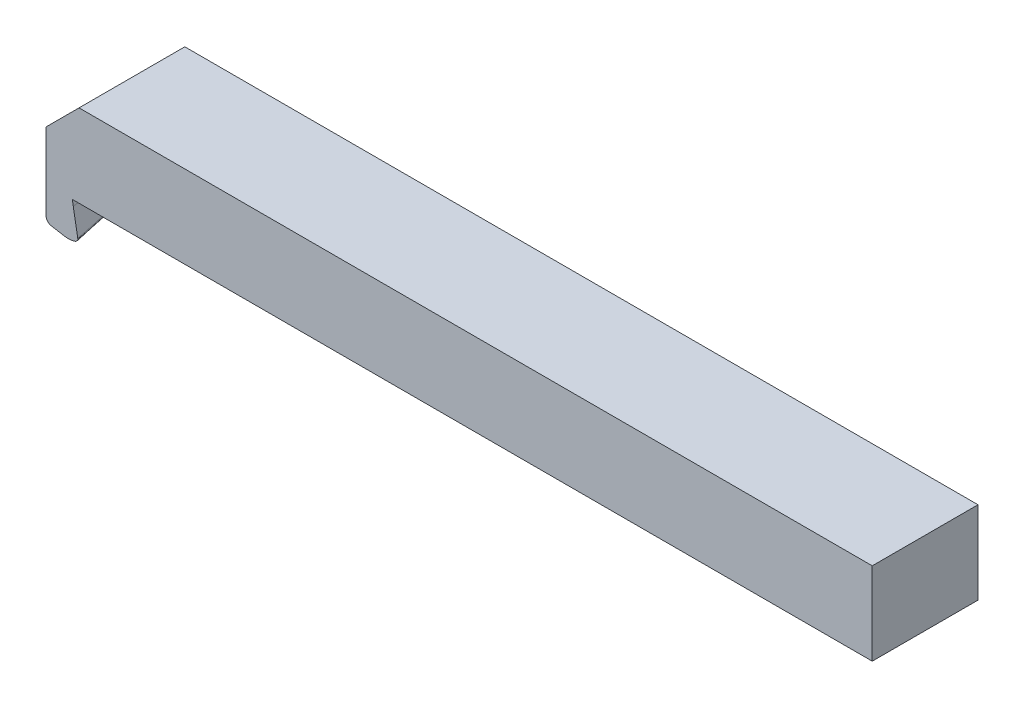
ISO-10303-21;
HEADER;
FILE_DESCRIPTION(('STEP AP214'),'2;1');
FILE_NAME('part.step','',(''),(''),'','','');
FILE_SCHEMA(('AUTOMOTIVE_DESIGN { 1 0 10303 214 1 1 1 1 }'));
ENDSEC;
DATA;
#1=APPLICATION_CONTEXT('core data for automotive mechanical design processes');
#2=APPLICATION_PROTOCOL_DEFINITION('international standard','automotive_design',2000,#1);
#3=PRODUCT_CONTEXT('',#1,'mechanical');
#4=PRODUCT('Part','Part','',(#3));
#5=PRODUCT_RELATED_PRODUCT_CATEGORY('part','',(#4));
#6=PRODUCT_DEFINITION_FORMATION('','',#4);
#7=PRODUCT_DEFINITION_CONTEXT('part definition',#1,'design');
#8=PRODUCT_DEFINITION('design','',#6,#7);
#9=PRODUCT_DEFINITION_SHAPE('','',#8);
#10=(LENGTH_UNIT() NAMED_UNIT(*) SI_UNIT(.MILLI.,.METRE.));
#11=(NAMED_UNIT(*) PLANE_ANGLE_UNIT() SI_UNIT($,.RADIAN.));
#12=(NAMED_UNIT(*) SI_UNIT($,.STERADIAN.) SOLID_ANGLE_UNIT());
#13=UNCERTAINTY_MEASURE_WITH_UNIT(LENGTH_MEASURE(1.E-05),#10,'distance_accuracy_value','');
#14=(GEOMETRIC_REPRESENTATION_CONTEXT(3) GLOBAL_UNCERTAINTY_ASSIGNED_CONTEXT((#13)) GLOBAL_UNIT_ASSIGNED_CONTEXT((#10,
#11,#12)) REPRESENTATION_CONTEXT('',''));
#15=CARTESIAN_POINT('',(0.,0.,0.));
#16=DIRECTION('',(0.,0.,1.));
#17=DIRECTION('',(1.,0.,0.));
#18=AXIS2_PLACEMENT_3D('',#15,#16,#17);
#19=CARTESIAN_POINT('',(-5.95745597294686,-8.78626996850213,0.));
#20=DIRECTION('',(-0.172807384598718,-0.980039378570434,-0.0982874573861199));
#21=DIRECTION('',(0.984807753012209,-0.173648177666924,0.));
#22=AXIS2_PLACEMENT_3D('',#19,#20,#21);
#23=PLANE('',#22);
#24=DIRECTION('',(0.,-0.0997887149885709,0.995008649390009));
#25=VECTOR('',#24,1.);
#26=CARTESIAN_POINT('',(1.65270364466615,-6.60104733206253,-35.1692485132997));
#27=LINE('',#26,#25);
#28=CARTESIAN_POINT('',(1.65270364466615,-7.23813574442296,-28.816741811541));
#29=VERTEX_POINT('',#28);
#30=CARTESIAN_POINT('',(1.65270364466615,-10.1281464365853,0.));
#31=VERTEX_POINT('',#30);
#32=EDGE_CURVE('E64',#29,#31,#27,.T.);
#33=ORIENTED_EDGE('',*,*,#32,.F.);
#34=DIRECTION('',(0.120990158545817,-0.12015437805514,0.985354914215807));
#35=VECTOR('',#34,1.);
#36=CARTESIAN_POINT('',(0.697622706499073,-6.28965235125239,-36.5950083020371));
#37=LINE('',#36,#35);
#38=CARTESIAN_POINT('',(5.19106541690834,-10.752055084539,0.));
#39=VERTEX_POINT('',#38);
#40=EDGE_CURVE('E71',#29,#39,#37,.T.);
#41=ORIENTED_EDGE('',*,*,#40,.T.);
#42=DIRECTION('',(-0.984807753012209,0.173648177666924,0.));
#43=VECTOR('',#42,1.);
#44=CARTESIAN_POINT('',(-1.68217993521837,-9.54011648393002,0.));
#45=LINE('',#44,#43);
#46=EDGE_CURVE('E148',#39,#31,#45,.T.);
#47=ORIENTED_EDGE('',*,*,#46,.T.);
#48=EDGE_LOOP('',(#33,#41,#47));
#49=FACE_BOUND('',#48,.T.);
#50=ADVANCED_FACE('F51',(#49),#23,.T.);
#51=CARTESIAN_POINT('',(4.31739641750005,2.24596703289002,-31.9999996430777));
#52=DIRECTION('',(-0.979944728638938,-0.172790716653391,0.099255715458433));
#53=DIRECTION('',(0.173648198516169,-0.984807749335925,0.));
#54=AXIS2_PLACEMENT_3D('',#51,#52,#53);
#55=PLANE('',#54);
#56=DIRECTION('',(0.120990158545817,-0.12015437805514,0.985354914215807));
#57=VECTOR('',#56,1.);
#58=CARTESIAN_POINT('',(5.12753518504776,-4.98805609598557,-36.5950083020371));
#59=LINE('',#58,#57);
#60=CARTESIAN_POINT('',(5.69174876336723,-5.54837217795491,-32.0000013300127));
#61=VERTEX_POINT('',#60);
#62=CARTESIAN_POINT('',(9.62097789545703,-9.45045882927214,0.));
#63=VERTEX_POINT('',#62);
#64=EDGE_CURVE('E140',#61,#63,#59,.T.);
#65=ORIENTED_EDGE('',*,*,#64,.F.);
#66=DIRECTION('',(0.17364817766692,-0.984807753012187,-2.12243050308961E-07));
#67=VECTOR('',#66,1.);
#68=CARTESIAN_POINT('',(4.31739641750005,2.24596703289002,-31.9999996430777));
#69=LINE('',#68,#67);
#70=CARTESIAN_POINT('',(4.31739641750005,2.24596703289002,-31.9999996430777));
#71=VERTEX_POINT('',#70);
#72=EDGE_CURVE('E164',#71,#61,#69,.T.);
#73=ORIENTED_EDGE('',*,*,#72,.F.);
#74=DIRECTION('',(-0.120990158545817,0.120154378055141,-0.985354914215807));
#75=VECTOR('',#74,1.);
#76=CARTESIAN_POINT('',(4.31739641750005,2.24596703289002,-31.9999996430777));
#77=LINE('',#76,#75);
#78=CARTESIAN_POINT('',(8.24662560559889,-1.65611967404935,2.14307765758873E-06));
#79=VERTEX_POINT('',#78);
#80=EDGE_CURVE('E245',#79,#71,#77,.T.);
#81=ORIENTED_EDGE('',*,*,#80,.F.);
#82=DIRECTION('',(0.17364817766692,-0.984807753012187,-2.12243050308961E-07));
#83=VECTOR('',#82,1.);
#84=CARTESIAN_POINT('',(8.24662560559889,-1.65611967404935,2.14307765758873E-06));
#85=LINE('',#84,#83);
#86=EDGE_CURVE('E156',#79,#63,#85,.T.);
#87=ORIENTED_EDGE('',*,*,#86,.T.);
#88=EDGE_LOOP('',(#65,#73,#81,#87));
#89=FACE_BOUND('',#88,.T.);
#90=ADVANCED_FACE('F274',(#89),#55,.F.);
#91=CARTESIAN_POINT('',(0.,0.,0.));
#92=DIRECTION('',(-1.,0.,0.));
#93=DIRECTION('',(0.,0.,1.));
#94=AXIS2_PLACEMENT_3D('',#91,#92,#93);
#95=PLANE('',#94);
#96=DIRECTION('',(0.,1.,0.));
#97=VECTOR('',#96,1.);
#98=CARTESIAN_POINT('',(0.,0.,-32.));
#99=LINE('',#98,#97);
#100=CARTESIAN_POINT('',(0.,-4.94927352200275,-32.));
#101=VERTEX_POINT('',#100);
#102=CARTESIAN_POINT('',(0.,15.,-32.));
#103=VERTEX_POINT('',#102);
#104=EDGE_CURVE('E174',#101,#103,#99,.T.);
#105=ORIENTED_EDGE('',*,*,#104,.F.);
#106=DIRECTION('',(0.,-0.0997887149885709,0.995008649390009));
#107=VECTOR('',#106,1.);
#108=CARTESIAN_POINT('',(0.,-4.63143182603811,-35.1692485132997));
#109=LINE('',#108,#107);
#110=CARTESIAN_POINT('',(0.,-8.15853093056085,0.));
#111=VERTEX_POINT('',#110);
#112=EDGE_CURVE('E216',#101,#111,#109,.T.);
#113=ORIENTED_EDGE('',*,*,#112,.T.);
#114=DIRECTION('',(0.,1.,0.));
#115=VECTOR('',#114,1.);
#116=CARTESIAN_POINT('',(0.,0.,0.));
#117=LINE('',#116,#115);
#118=CARTESIAN_POINT('',(0.,15.,0.));
#119=VERTEX_POINT('',#118);
#120=EDGE_CURVE('E169',#111,#119,#117,.T.);
#121=ORIENTED_EDGE('',*,*,#120,.T.);
#122=DIRECTION('',(0.,0.,-1.));
#123=VECTOR('',#122,1.);
#124=CARTESIAN_POINT('',(0.,15.,0.));
#125=LINE('',#124,#123);
#126=EDGE_CURVE('E193',#119,#103,#125,.T.);
#127=ORIENTED_EDGE('',*,*,#126,.T.);
#128=EDGE_LOOP('',(#105,#113,#121,#127));
#129=FACE_BOUND('',#128,.T.);
#130=ADVANCED_FACE('F286',(#129),#95,.T.);
#131=CARTESIAN_POINT('',(7.95460702378189,0.,-32.00005));
#132=DIRECTION('',(-0.984807753012209,-0.173648177666924,0.));
#133=DIRECTION('',(0.173648177666924,-0.984807753012209,0.));
#134=AXIS2_PLACEMENT_3D('',#131,#132,#133);
#135=PLANE('',#134);
#136=DIRECTION('',(0.0181511771607508,-0.102940441036431,0.994521895368274));
#137=VECTOR('',#136,1.);
#138=CARTESIAN_POINT('',(8.24662560559889,-1.65611967404935,2.14307765758873E-06));
#139=LINE('',#138,#137);
#140=CARTESIAN_POINT('',(7.9546070237819,0.,-15.9999999999999));
#141=VERTEX_POINT('',#140);
#142=EDGE_CURVE('E250',#141,#79,#139,.T.);
#143=ORIENTED_EDGE('',*,*,#142,.F.);
#144=DIRECTION('',(0.,0.,1.));
#145=VECTOR('',#144,1.);
#146=CARTESIAN_POINT('',(7.95460702378189,0.,-32.00005));
#147=LINE('',#146,#145);
#148=CARTESIAN_POINT('',(7.95460702378189,0.,0.));
#149=VERTEX_POINT('',#148);
#150=EDGE_CURVE('E159',#141,#149,#147,.T.);
#151=ORIENTED_EDGE('',*,*,#150,.T.);
#152=DIRECTION('',(0.173648177666924,-0.984807753012209,0.));
#153=VECTOR('',#152,1.);
#154=CARTESIAN_POINT('',(7.95460702378189,0.,0.));
#155=LINE('',#154,#153);
#156=EDGE_CURVE('E155',#149,#79,#155,.T.);
#157=ORIENTED_EDGE('',*,*,#156,.T.);
#158=EDGE_LOOP('',(#143,#151,#157));
#159=FACE_BOUND('',#158,.T.);
#160=ADVANCED_FACE('F270',(#159),#135,.F.);
#161=CARTESIAN_POINT('',(250.,0.,-32.));
#162=DIRECTION('',(0.,0.,1.));
#163=DIRECTION('',(0.,-1.,0.));
#164=AXIS2_PLACEMENT_3D('',#161,#162,#163);
#165=PLANE('',#164);
#166=ORIENTED_EDGE('',*,*,#72,.T.);
#167=CARTESIAN_POINT('',(5.69174892667737,-5.54837234013692,-32.));
#168=CARTESIAN_POINT('',(5.69559472201444,-5.57015293719416,-32.));
#169=CARTESIAN_POINT('',(5.69861002660108,-5.59208733819349,-32.));
#170=CARTESIAN_POINT('',(5.70287976276934,-5.63613886613255,-32.));
#171=CARTESIAN_POINT('',(5.70413314621049,-5.65825609397151,-32.));
#172=CARTESIAN_POINT('',(5.70477333565546,-5.70245326938706,-32.));
#173=CARTESIAN_POINT('',(5.70416593957293,-5.72453311871634,-32.));
#174=CARTESIAN_POINT('',(5.70105025073482,-5.76854749261631,-32.));
#175=CARTESIAN_POINT('',(5.69854242927031,-5.79048205185761,-32.));
#176=CARTESIAN_POINT('',(5.68811127617272,-5.85597878510246,-32.));
#177=CARTESIAN_POINT('',(5.67727820010267,-5.89911510416177,-32.));
#178=CARTESIAN_POINT('',(5.64843766040005,-5.98284511814917,-32.));
#179=CARTESIAN_POINT('',(5.63043142238097,-6.0234392460681,-32.));
#180=CARTESIAN_POINT('',(5.58302247155904,-6.11125356889244,-32.));
#181=CARTESIAN_POINT('',(5.5518859457596,-6.15753282402396,-32.));
#182=CARTESIAN_POINT('',(5.48257072191082,-6.24450993204478,-32.));
#183=CARTESIAN_POINT('',(5.44437257713406,-6.28519181734676,-32.));
#184=CARTESIAN_POINT('',(5.33898887715764,-6.383778664835,-32.));
#185=CARTESIAN_POINT('',(5.26803448432665,-6.43761332328303,-32.));
#186=CARTESIAN_POINT('',(5.11912408713444,-6.53432952908048,-32.));
#187=CARTESIAN_POINT('',(5.04115254704482,-6.57718592256942,-32.));
#188=CARTESIAN_POINT('',(4.88184885908664,-6.65380841283425,-32.));
#189=CARTESIAN_POINT('',(4.80055546322167,-6.68765663917548,-32.));
#190=CARTESIAN_POINT('',(4.63539152483625,-6.74845025453767,-32.));
#191=CARTESIAN_POINT('',(4.55151852291068,-6.77538881203322,-32.));
#192=CARTESIAN_POINT('',(4.3819440776994,-6.82358019758212,-32.));
#193=CARTESIAN_POINT('',(4.29623844846271,-6.84481806488145,-32.));
#194=CARTESIAN_POINT('',(4.1238040620772,-6.88238012866922,-32.));
#195=CARTESIAN_POINT('',(4.0370756549592,-6.89870595826316,-32.));
#196=CARTESIAN_POINT('',(3.85487664905755,-6.92841536401401,-32.));
#197=CARTESIAN_POINT('',(3.75933952713402,-6.94138704514333,-32.));
#198=CARTESIAN_POINT('',(3.56775846644736,-6.9628738826745,-32.));
#199=CARTESIAN_POINT('',(3.47171442103082,-6.9713880601471,-32.));
#200=CARTESIAN_POINT('',(3.1830168755023,-6.99097908373765,-32.));
#201=CARTESIAN_POINT('',(2.98994329744629,-6.99608241625166,-32.));
#202=CARTESIAN_POINT('',(2.60406042916701,-6.9928662446588,-32.));
#203=CARTESIAN_POINT('',(2.41125106792124,-6.9845516697429,-32.));
#204=CARTESIAN_POINT('',(2.02665006236218,-6.9559042794159,-32.));
#205=CARTESIAN_POINT('',(1.83485782434515,-6.93557949439614,-32.));
#206=CARTESIAN_POINT('',(1.5799482413055,-6.900918657548,-32.));
#207=CARTESIAN_POINT('',(1.51611658421911,-6.8915947455943,-32.));
#208=CARTESIAN_POINT('',(1.38876713457079,-6.87170909050232,-32.));
#209=CARTESIAN_POINT('',(1.32524898004394,-6.86114966565831,-32.));
#210=CARTESIAN_POINT('',(1.26183644812868,-6.84996859540374,-32.));
#211=B_SPLINE_CURVE_WITH_KNOTS('',3,(#167,#168,#169,#170,#171,#172,#173,#174,#175,#176,#177,
#178,#179,#180,#181,#182,#183,#184,#185,#186,#187,#188,#189,#190,#191,#192,#193,#194,#195,#196,
#197,#198,#199,#200,#201,#202,#203,#204,#205,#206,#207,#208,#209,#210),.UNSPECIFIED.,.F.,.F.,(4,
2,2,2,2,2,2,2,2,2,2,2,2,2,2,2,2,2,2,2,2,4),(0.,0.0663468393432494,0.132733130748207,
0.198912782902435,0.265076028374439,0.397754404350359,0.530410120485305,0.696807636653573,
0.863670405781838,1.12936352558054,1.39566007469845,1.6594384025841,1.92347652904579,
2.18820096214419,2.45283728478962,2.74195462892563,3.03113544061048,3.60993656418424,
4.18852510827154,4.7667272275244,4.96024585856891,5.1534070283953),.UNSPECIFIED.);
#212=CARTESIAN_POINT('',(1.5319357455685,-6.89373115985658,-32.0000008930785));
#213=VERTEX_POINT('',#212);
#214=EDGE_CURVE('E210',#61,#213,#211,.T.);
#215=ORIENTED_EDGE('',*,*,#214,.T.);
#216=CARTESIAN_POINT('',(1.65270364466615,-6.91888902802717,-32.));
#217=CARTESIAN_POINT('',(1.59810504045706,-6.90926145178013,-32.));
#218=CARTESIAN_POINT('',(1.54393231148034,-6.89736744351519,-32.));
#219=CARTESIAN_POINT('',(1.43676264945639,-6.86912701960965,-32.));
#220=CARTESIAN_POINT('',(1.383765665894,-6.85278079565789,-32.));
#221=CARTESIAN_POINT('',(1.2271053599493,-6.79721415288483,-32.));
#222=CARTESIAN_POINT('',(1.12567963052524,-6.75144927019023,-32.));
#223=CARTESIAN_POINT('',(0.931853360863136,-6.64378505186223,-32.));
#224=CARTESIAN_POINT('',(0.83945282062508,-6.58188571622883,-32.));
#225=CARTESIAN_POINT('',(0.666156590444165,-6.44364319370646,-32.));
#226=CARTESIAN_POINT('',(0.585260900501306,-6.36730000681748,-32.));
#227=CARTESIAN_POINT('',(0.437223610426427,-6.20227708425503,-32.));
#228=CARTESIAN_POINT('',(0.370082010294406,-6.11359734858155,-32.));
#229=CARTESIAN_POINT('',(0.251401521567228,-5.92635728729381,-32.));
#230=CARTESIAN_POINT('',(0.199862632972071,-5.82779696167955,-32.));
#231=CARTESIAN_POINT('',(0.113803992517514,-5.62347228928078,-32.));
#232=CARTESIAN_POINT('',(0.0792842406581132,-5.51770794249626,-32.));
#233=CARTESIAN_POINT('',(0.0359254874969161,-5.33452194314829,-32.));
#234=CARTESIAN_POINT('',(0.0224833940343868,-5.25815662372228,-32.));
#235=CARTESIAN_POINT('',(0.0045088536140932,-5.10429712795233,-32.));
#236=CARTESIAN_POINT('',(-1.34871086183653E-05,-5.02680177124689,-32.));
#237=CARTESIAN_POINT('',(0.,-4.94927352200282,-32.));
#238=B_SPLINE_CURVE_WITH_KNOTS('',3,(#216,#217,#218,#219,#220,#221,#222,#223,#224,#225,#226,
#227,#228,#229,#230,#231,#232,#233,#234,#235,#236,#237),.UNSPECIFIED.,.F.,.F.,(4,2,2,2,2,2,2,2,
2,2,4),(0.,0.166223517867541,0.332439880160971,0.664592604920614,0.996745329680258,
1.3288980544399,1.66105077919954,1.99320350395919,2.32535622871883,2.55748278536999,
2.789872194712),.UNSPECIFIED.);
#239=EDGE_CURVE('E208',#213,#101,#238,.T.);
#240=ORIENTED_EDGE('',*,*,#239,.T.);
#241=ORIENTED_EDGE('',*,*,#104,.T.);
#242=DIRECTION('',(-0.707106781186549,-0.707106781186546,0.));
#243=VECTOR('',#242,1.);
#244=CARTESIAN_POINT('',(0.,15.,-32.));
#245=LINE('',#244,#243);
#246=CARTESIAN_POINT('',(10.0000000000001,25.,-32.));
#247=VERTEX_POINT('',#246);
#248=EDGE_CURVE('E198',#103,#247,#245,.F.);
#249=ORIENTED_EDGE('',*,*,#248,.T.);
#250=DIRECTION('',(-1.,0.,0.));
#251=VECTOR('',#250,1.);
#252=CARTESIAN_POINT('',(250.,25.,-32.));
#253=LINE('',#252,#251);
#254=CARTESIAN_POINT('',(250.,25.,-32.));
#255=VERTEX_POINT('',#254);
#256=EDGE_CURVE('E264',#255,#247,#253,.T.);
#257=ORIENTED_EDGE('',*,*,#256,.F.);
#258=DIRECTION('',(0.,1.,0.));
#259=VECTOR('',#258,1.);
#260=CARTESIAN_POINT('',(250.,0.,-32.));
#261=LINE('',#260,#259);
#262=CARTESIAN_POINT('',(250.,0.,-32.));
#263=VERTEX_POINT('',#262);
#264=EDGE_CURVE('E177',#263,#255,#261,.T.);
#265=ORIENTED_EDGE('',*,*,#264,.F.);
#266=DIRECTION('',(-1.,0.,0.));
#267=VECTOR('',#266,1.);
#268=CARTESIAN_POINT('',(250.,0.,-32.));
#269=LINE('',#268,#267);
#270=CARTESIAN_POINT('',(7.95460702378191,0.,-32.));
#271=VERTEX_POINT('',#270);
#272=EDGE_CURVE('E194',#263,#271,#269,.T.);
#273=ORIENTED_EDGE('',*,*,#272,.T.);
#274=DIRECTION('',(0.17364817766692,-0.984807753012187,-2.12243050308961E-07));
#275=VECTOR('',#274,1.);
#276=CARTESIAN_POINT('',(7.66258848759279,1.65611941528069,-31.9999996430777));
#277=LINE('',#276,#275);
#278=CARTESIAN_POINT('',(7.66258848759279,1.65611941528069,-31.9999996430777));
#279=VERTEX_POINT('',#278);
#280=EDGE_CURVE('E161',#279,#271,#277,.T.);
#281=ORIENTED_EDGE('',*,*,#280,.F.);
#282=DIRECTION('',(0.984807753012209,-0.173648177666924,0.));
#283=VECTOR('',#282,1.);
#284=CARTESIAN_POINT('',(7.66258848759279,1.65611941528069,-31.9999996430777));
#285=LINE('',#284,#283);
#286=EDGE_CURVE('E248',#71,#279,#285,.T.);
#287=ORIENTED_EDGE('',*,*,#286,.F.);
#288=EDGE_LOOP('',(#166,#215,#240,#241,#249,#257,#265,#273,#281,#287));
#289=FACE_BOUND('',#288,.T.);
#290=ADVANCED_FACE('F213',(#289),#165,.F.);
#291=CARTESIAN_POINT('',(250.,0.,0.));
#292=DIRECTION('',(0.,0.,1.));
#293=DIRECTION('',(0.,-1.,0.));
#294=AXIS2_PLACEMENT_3D('',#291,#292,#293);
#295=PLANE('',#294);
#296=CARTESIAN_POINT('',(5.5,-9.,0.));
#297=DIRECTION('',(0.,0.,-1.));
#298=DIRECTION('',(0.984807753012209,-0.173648177666923,0.));
#299=AXIS2_PLACEMENT_3D('',#296,#297,#298);
#300=ELLIPSE('',#299,4.1857969069926,1.77908335833059);
#301=EDGE_CURVE('E137',#63,#39,#300,.T.);
#302=ORIENTED_EDGE('',*,*,#301,.F.);
#303=ORIENTED_EDGE('',*,*,#86,.F.);
#304=ORIENTED_EDGE('',*,*,#156,.F.);
#305=DIRECTION('',(-1.,0.,0.));
#306=VECTOR('',#305,1.);
#307=CARTESIAN_POINT('',(250.,0.,0.));
#308=LINE('',#307,#306);
#309=CARTESIAN_POINT('',(250.,0.,0.));
#310=VERTEX_POINT('',#309);
#311=EDGE_CURVE('E189',#310,#149,#308,.T.);
#312=ORIENTED_EDGE('',*,*,#311,.F.);
#313=DIRECTION('',(0.,1.,0.));
#314=VECTOR('',#313,1.);
#315=CARTESIAN_POINT('',(250.,0.,0.));
#316=LINE('',#315,#314);
#317=CARTESIAN_POINT('',(250.,25.,0.));
#318=VERTEX_POINT('',#317);
#319=EDGE_CURVE('E170',#310,#318,#316,.T.);
#320=ORIENTED_EDGE('',*,*,#319,.T.);
#321=DIRECTION('',(-1.,0.,0.));
#322=VECTOR('',#321,1.);
#323=CARTESIAN_POINT('',(250.,25.,0.));
#324=LINE('',#323,#322);
#325=CARTESIAN_POINT('',(10.,25.,0.));
#326=VERTEX_POINT('',#325);
#327=EDGE_CURVE('E181',#318,#326,#324,.T.);
#328=ORIENTED_EDGE('',*,*,#327,.T.);
#329=DIRECTION('',(0.707106781186549,0.707106781186546,0.));
#330=VECTOR('',#329,1.);
#331=CARTESIAN_POINT('',(117.500000000001,132.5,0.));
#332=LINE('',#331,#330);
#333=EDGE_CURVE('E201',#326,#119,#332,.F.);
#334=ORIENTED_EDGE('',*,*,#333,.T.);
#335=ORIENTED_EDGE('',*,*,#120,.F.);
#336=CARTESIAN_POINT('',(2.,-8.15853093056085,0.));
#337=DIRECTION('',(0.,0.,-1.));
#338=DIRECTION('',(1.,0.,0.));
#339=AXIS2_PLACEMENT_3D('',#336,#337,#338);
#340=CIRCLE('',#339,2.);
#341=EDGE_CURVE('E154',#31,#111,#340,.T.);
#342=ORIENTED_EDGE('',*,*,#341,.F.);
#343=ORIENTED_EDGE('',*,*,#46,.F.);
#344=EDGE_LOOP('',(#302,#303,#304,#312,#320,#328,#334,#335,#342,#343));
#345=FACE_BOUND('',#344,.T.);
#346=ADVANCED_FACE('F152',(#345),#295,.T.);
#347=CARTESIAN_POINT('',(250.,0.,0.));
#348=DIRECTION('',(0.,1.,0.));
#349=DIRECTION('',(0.,0.,1.));
#350=AXIS2_PLACEMENT_3D('',#347,#348,#349);
#351=PLANE('',#350);
#352=ORIENTED_EDGE('',*,*,#311,.T.);
#353=ORIENTED_EDGE('',*,*,#150,.F.);
#354=EDGE_CURVE('E167',#271,#141,#147,.T.);
#355=ORIENTED_EDGE('',*,*,#354,.F.);
#356=ORIENTED_EDGE('',*,*,#272,.F.);
#357=DIRECTION('',(0.,0.,-1.));
#358=VECTOR('',#357,1.);
#359=CARTESIAN_POINT('',(250.,0.,0.));
#360=LINE('',#359,#358);
#361=EDGE_CURVE('E179',#310,#263,#360,.T.);
#362=ORIENTED_EDGE('',*,*,#361,.F.);
#363=EDGE_LOOP('',(#352,#353,#355,#356,#362));
#364=FACE_BOUND('',#363,.T.);
#365=ADVANCED_FACE('F266',(#364),#351,.F.);
#366=CARTESIAN_POINT('',(250.,25.,0.));
#367=DIRECTION('',(0.,1.,0.));
#368=DIRECTION('',(0.,0.,1.));
#369=AXIS2_PLACEMENT_3D('',#366,#367,#368);
#370=PLANE('',#369);
#371=ORIENTED_EDGE('',*,*,#256,.T.);
#372=DIRECTION('',(0.,0.,1.));
#373=VECTOR('',#372,1.);
#374=CARTESIAN_POINT('',(10.0000000000001,25.,0.));
#375=LINE('',#374,#373);
#376=EDGE_CURVE('E78',#247,#326,#375,.T.);
#377=ORIENTED_EDGE('',*,*,#376,.T.);
#378=ORIENTED_EDGE('',*,*,#327,.F.);
#379=DIRECTION('',(0.,0.,-1.));
#380=VECTOR('',#379,1.);
#381=CARTESIAN_POINT('',(250.,25.,0.));
#382=LINE('',#381,#380);
#383=EDGE_CURVE('E173',#318,#255,#382,.T.);
#384=ORIENTED_EDGE('',*,*,#383,.T.);
#385=EDGE_LOOP('',(#371,#377,#378,#384));
#386=FACE_BOUND('',#385,.T.);
#387=ADVANCED_FACE('F279',(#386),#370,.T.);
#388=CARTESIAN_POINT('',(250.,0.,0.));
#389=DIRECTION('',(-1.,0.,0.));
#390=DIRECTION('',(0.,0.,1.));
#391=AXIS2_PLACEMENT_3D('',#388,#389,#390);
#392=PLANE('',#391);
#393=ORIENTED_EDGE('',*,*,#319,.F.);
#394=ORIENTED_EDGE('',*,*,#361,.T.);
#395=ORIENTED_EDGE('',*,*,#264,.T.);
#396=ORIENTED_EDGE('',*,*,#383,.F.);
#397=EDGE_LOOP('',(#393,#394,#395,#396));
#398=FACE_BOUND('',#397,.T.);
#399=ADVANCED_FACE('F278',(#398),#392,.F.);
#400=CARTESIAN_POINT('',(0.,15.,0.));
#401=DIRECTION('',(0.707106781186545,-0.707106781186549,0.));
#402=DIRECTION('',(0.,0.,-1.));
#403=AXIS2_PLACEMENT_3D('',#400,#401,#402);
#404=PLANE('',#403);
#405=ORIENTED_EDGE('',*,*,#333,.F.);
#406=ORIENTED_EDGE('',*,*,#376,.F.);
#407=ORIENTED_EDGE('',*,*,#248,.F.);
#408=ORIENTED_EDGE('',*,*,#126,.F.);
#409=EDGE_LOOP('',(#405,#406,#407,#408));
#410=FACE_BOUND('',#409,.T.);
#411=ADVANCED_FACE('F53',(#410),#404,.F.);
#412=CARTESIAN_POINT('',(8.24662560559889,-1.65611967404935,2.14307765758873E-06));
#413=DIRECTION('',(0.984807753012209,0.173648177666924,0.));
#414=DIRECTION('',(-0.173648177666924,0.984807753012209,0.));
#415=AXIS2_PLACEMENT_3D('',#412,#413,#414);
#416=PLANE('',#415);
#417=EDGE_CURVE('E251',#279,#141,#139,.T.);
#418=ORIENTED_EDGE('',*,*,#417,.F.);
#419=ORIENTED_EDGE('',*,*,#280,.T.);
#420=ORIENTED_EDGE('',*,*,#354,.T.);
#421=EDGE_LOOP('',(#418,#419,#420));
#422=FACE_BOUND('',#421,.T.);
#423=ADVANCED_FACE('F257',(#422),#416,.F.);
#424=CARTESIAN_POINT('',(-3.41930375773094,0.49592541493057,-0.947526584857156));
#425=DIRECTION('',(-0.172807384598718,-0.980039378570434,-0.0982874573861199));
#426=DIRECTION('',(0.984807753012209,-0.173648177666924,0.));
#427=AXIS2_PLACEMENT_3D('',#424,#425,#426);
#428=PLANE('',#427);
#429=ORIENTED_EDGE('',*,*,#80,.T.);
#430=ORIENTED_EDGE('',*,*,#286,.T.);
#431=ORIENTED_EDGE('',*,*,#417,.T.);
#432=ORIENTED_EDGE('',*,*,#142,.T.);
#433=EDGE_LOOP('',(#429,#430,#431,#432));
#434=FACE_BOUND('',#433,.T.);
#435=ADVANCED_FACE('F236',(#434),#428,.T.);
#436=CARTESIAN_POINT('',(2.,-4.63143182603811,-35.1692485132997));
#437=DIRECTION('',(0.,0.,-1.));
#438=DIRECTION('',(1.,0.,0.));
#439=AXIS2_PLACEMENT_3D('',#436,#437,#438);
#440=CIRCLE('',#439,2.);
#441=DIRECTION('',(0.,-0.0997887149885709,0.995008649390009));
#442=VECTOR('',#441,1.);
#443=SURFACE_OF_LINEAR_EXTRUSION('',#440,#442);
#444=ORIENTED_EDGE('',*,*,#239,.F.);
#445=CARTESIAN_POINT('',(1.53193574555529,-6.89373115985409,-32.0000008930777));
#446=CARTESIAN_POINT('',(1.57017981730537,-7.00458408609522,-30.9864424491718));
#447=CARTESIAN_POINT('',(1.6086276339971,-7.11430907987195,-29.9727703250386));
#448=CARTESIAN_POINT('',(1.6490868996452,-7.22798514279318,-28.9115705329587));
#449=CARTESIAN_POINT('',(1.65089504932376,-7.23306167720608,-28.8641562965796));
#450=CARTESIAN_POINT('',(1.65270364466615,-7.23813574442299,-28.8167418115408));
#451=B_SPLINE_CURVE_WITH_KNOTS('',3,(#445,#446,#447,#448,#449,#450),.UNSPECIFIED.,.F.,.F.,(4,2,
4),(0.,3.06095423961412,3.20411273138067),.UNSPECIFIED.);
#452=EDGE_CURVE('E12',#213,#29,#451,.T.);
#453=ORIENTED_EDGE('',*,*,#452,.T.);
#454=ORIENTED_EDGE('',*,*,#32,.T.);
#455=ORIENTED_EDGE('',*,*,#341,.T.);
#456=ORIENTED_EDGE('',*,*,#112,.F.);
#457=EDGE_LOOP('',(#444,#453,#454,#455,#456));
#458=FACE_BOUND('',#457,.T.);
#459=ADVANCED_FACE('F205',(#458),#443,.F.);
#460=CARTESIAN_POINT('',(1.00655728959073,-4.53759726671343,-36.5950083020371));
#461=DIRECTION('',(0.,0.,-1.));
#462=DIRECTION('',(0.984807753012209,-0.173648177666923,0.));
#463=AXIS2_PLACEMENT_3D('',#460,#461,#462);
#464=ELLIPSE('',#463,4.1857969069926,1.77908335833059);
#465=DIRECTION('',(0.120990158545817,-0.12015437805514,0.985354914215807));
#466=VECTOR('',#465,1.);
#467=SURFACE_OF_LINEAR_EXTRUSION('',#464,#466);
#468=ORIENTED_EDGE('',*,*,#64,.T.);
#469=ORIENTED_EDGE('',*,*,#301,.T.);
#470=ORIENTED_EDGE('',*,*,#40,.F.);
#471=ORIENTED_EDGE('',*,*,#452,.F.);
#472=ORIENTED_EDGE('',*,*,#214,.F.);
#473=EDGE_LOOP('',(#468,#469,#470,#471,#472));
#474=FACE_BOUND('',#473,.T.);
#475=ADVANCED_FACE('F138',(#474),#467,.F.);
#476=CLOSED_SHELL('',(#50,#90,#130,#160,#290,#346,#365,#387,#399,#411,#423,#435,#459,#475));
#477=MANIFOLD_SOLID_BREP('B2',#476);
#478=ADVANCED_BREP_SHAPE_REPRESENTATION('',(#18,#477),#14);
#479=SHAPE_DEFINITION_REPRESENTATION(#9,#478);
ENDSEC;
END-ISO-10303-21;
